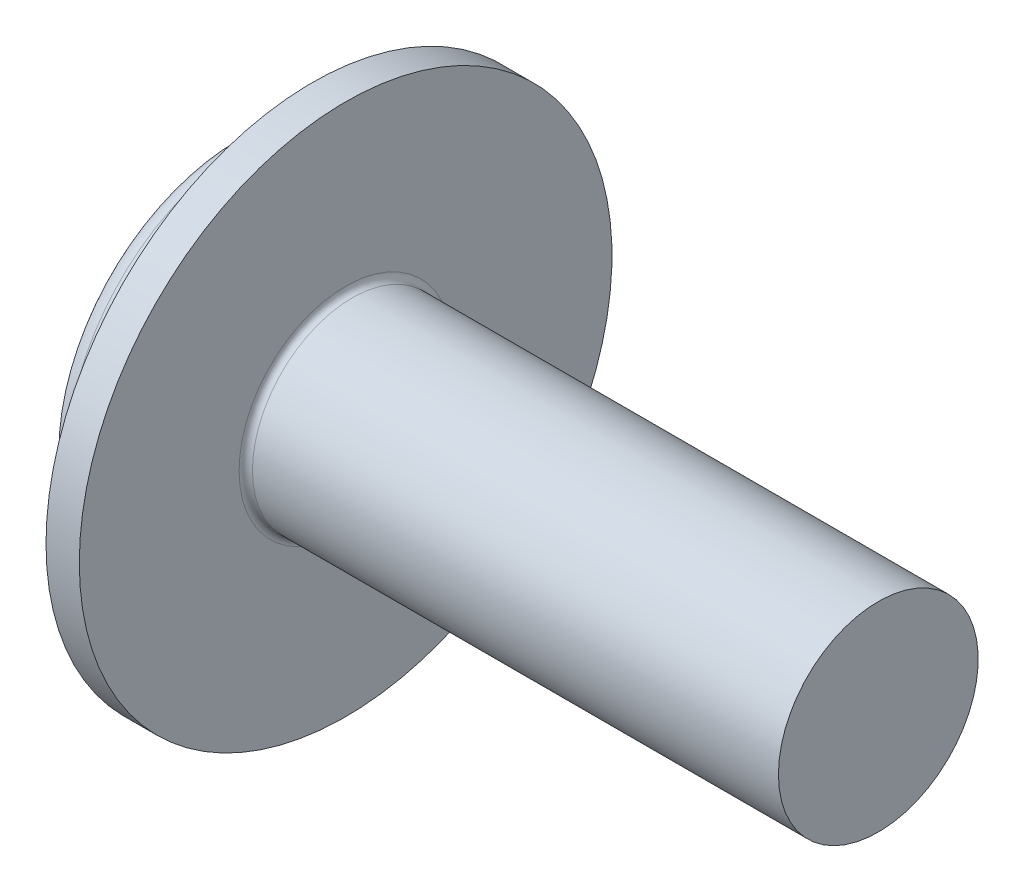
ISO-10303-21;
HEADER;
FILE_DESCRIPTION(('STEP AP214'),'2;1');
FILE_NAME('part.step','',(''),(''),'','','');
FILE_SCHEMA(('AUTOMOTIVE_DESIGN { 1 0 10303 214 1 1 1 1 }'));
ENDSEC;
DATA;
#1=APPLICATION_CONTEXT('core data for automotive mechanical design processes');
#2=APPLICATION_PROTOCOL_DEFINITION('international standard','automotive_design',2000,#1);
#3=PRODUCT_CONTEXT('',#1,'mechanical');
#4=PRODUCT('Part','Part','',(#3));
#5=PRODUCT_RELATED_PRODUCT_CATEGORY('part','',(#4));
#6=PRODUCT_DEFINITION_FORMATION('','',#4);
#7=PRODUCT_DEFINITION_CONTEXT('part definition',#1,'design');
#8=PRODUCT_DEFINITION('design','',#6,#7);
#9=PRODUCT_DEFINITION_SHAPE('','',#8);
#10=(LENGTH_UNIT() NAMED_UNIT(*) SI_UNIT(.MILLI.,.METRE.));
#11=(NAMED_UNIT(*) PLANE_ANGLE_UNIT() SI_UNIT($,.RADIAN.));
#12=(NAMED_UNIT(*) SI_UNIT($,.STERADIAN.) SOLID_ANGLE_UNIT());
#13=UNCERTAINTY_MEASURE_WITH_UNIT(LENGTH_MEASURE(1.E-05),#10,'distance_accuracy_value','');
#14=(GEOMETRIC_REPRESENTATION_CONTEXT(3) GLOBAL_UNCERTAINTY_ASSIGNED_CONTEXT((#13)) GLOBAL_UNIT_ASSIGNED_CONTEXT((#10,
#11,#12)) REPRESENTATION_CONTEXT('',''));
#15=CARTESIAN_POINT('',(0.,0.,0.));
#16=DIRECTION('',(0.,0.,1.));
#17=DIRECTION('',(1.,0.,0.));
#18=AXIS2_PLACEMENT_3D('',#15,#16,#17);
#19=CARTESIAN_POINT('',(-25.4,0.,0.));
#20=DIRECTION('',(-1.,0.,0.));
#21=DIRECTION('',(0.,0.,1.));
#22=AXIS2_PLACEMENT_3D('',#19,#20,#21);
#23=CYLINDRICAL_SURFACE('',#22,1.5);
#24=CARTESIAN_POINT('',(2.5,0.,0.));
#25=DIRECTION('',(-1.,0.,0.));
#26=DIRECTION('',(0.,0.,1.));
#27=AXIS2_PLACEMENT_3D('',#24,#25,#26);
#28=CIRCLE('',#27,1.5);
#29=CARTESIAN_POINT('',(2.5,0.,1.5));
#30=VERTEX_POINT('',#29);
#31=EDGE_CURVE('E293',#30,#30,#28,.F.);
#32=ORIENTED_EDGE('',*,*,#31,.T.);
#33=EDGE_LOOP('',(#32));
#34=FACE_BOUND('',#33,.T.);
#35=CARTESIAN_POINT('',(10.4,0.,0.));
#36=DIRECTION('',(-1.,0.,0.));
#37=DIRECTION('',(0.,0.,1.));
#38=AXIS2_PLACEMENT_3D('',#35,#36,#37);
#39=CIRCLE('',#38,1.5);
#40=CARTESIAN_POINT('',(10.4,0.,1.5));
#41=VERTEX_POINT('',#40);
#42=EDGE_CURVE('E247',#41,#41,#39,.T.);
#43=ORIENTED_EDGE('',*,*,#42,.T.);
#44=EDGE_LOOP('',(#43));
#45=FACE_BOUND('',#44,.T.);
#46=ADVANCED_FACE('F42',(#34,#45),#23,.T.);
#47=CARTESIAN_POINT('',(2.4,1.5,0.));
#48=DIRECTION('',(-1.,0.,0.));
#49=DIRECTION('',(0.,0.,1.));
#50=AXIS2_PLACEMENT_3D('',#47,#48,#49);
#51=PLANE('',#50);
#52=CARTESIAN_POINT('',(2.4,0.,0.));
#53=DIRECTION('',(-1.,0.,0.));
#54=DIRECTION('',(0.,0.,1.));
#55=AXIS2_PLACEMENT_3D('',#52,#53,#54);
#56=CIRCLE('',#55,1.6);
#57=CARTESIAN_POINT('',(2.4,0.,1.6));
#58=VERTEX_POINT('',#57);
#59=EDGE_CURVE('E289',#58,#58,#56,.T.);
#60=ORIENTED_EDGE('',*,*,#59,.T.);
#61=EDGE_LOOP('',(#60));
#62=FACE_BOUND('',#61,.T.);
#63=CARTESIAN_POINT('',(2.4,0.,0.));
#64=DIRECTION('',(-1.,0.,0.));
#65=DIRECTION('',(0.,0.,1.));
#66=AXIS2_PLACEMENT_3D('',#63,#64,#65);
#67=CIRCLE('',#66,4.);
#68=CARTESIAN_POINT('',(2.4,0.,4.));
#69=VERTEX_POINT('',#68);
#70=EDGE_CURVE('E206',#69,#69,#67,.T.);
#71=ORIENTED_EDGE('',*,*,#70,.F.);
#72=EDGE_LOOP('',(#71));
#73=FACE_BOUND('',#72,.T.);
#74=ADVANCED_FACE('F419',(#62,#73),#51,.F.);
#75=CARTESIAN_POINT('',(10.4,1.5,0.));
#76=DIRECTION('',(1.,0.,0.));
#77=DIRECTION('',(0.,0.,-1.));
#78=AXIS2_PLACEMENT_3D('',#75,#76,#77);
#79=PLANE('',#78);
#80=ORIENTED_EDGE('',*,*,#42,.F.);
#81=EDGE_LOOP('',(#80));
#82=FACE_BOUND('',#81,.T.);
#83=ADVANCED_FACE('F424',(#82),#79,.T.);
#84=CARTESIAN_POINT('',(2.5,0.,0.));
#85=DIRECTION('',(-1.,0.,0.));
#86=DIRECTION('',(0.,0.,1.));
#87=AXIS2_PLACEMENT_3D('',#84,#85,#86);
#88=TOROIDAL_SURFACE('',#87,1.6,0.1);
#89=ORIENTED_EDGE('',*,*,#31,.F.);
#90=EDGE_LOOP('',(#89));
#91=FACE_BOUND('',#90,.T.);
#92=ORIENTED_EDGE('',*,*,#59,.F.);
#93=EDGE_LOOP('',(#92));
#94=FACE_BOUND('',#93,.T.);
#95=ADVANCED_FACE('F44',(#91,#94),#88,.F.);
#96=CARTESIAN_POINT('',(1.9,0.,0.));
#97=DIRECTION('',(-1.,0.,0.));
#98=DIRECTION('',(0.,0.,1.));
#99=AXIS2_PLACEMENT_3D('',#96,#97,#98);
#100=PLANE('',#99);
#101=CARTESIAN_POINT('',(1.9,0.,0.));
#102=DIRECTION('',(-1.,0.,0.));
#103=DIRECTION('',(0.,0.,1.));
#104=AXIS2_PLACEMENT_3D('',#101,#102,#103);
#105=CIRCLE('',#104,4.);
#106=CARTESIAN_POINT('',(1.9,0.,4.));
#107=VERTEX_POINT('',#106);
#108=EDGE_CURVE('E591',#107,#107,#105,.T.);
#109=ORIENTED_EDGE('',*,*,#108,.T.);
#110=EDGE_LOOP('',(#109));
#111=FACE_BOUND('',#110,.T.);
#112=CARTESIAN_POINT('',(1.9,0.,0.));
#113=DIRECTION('',(-1.,0.,0.));
#114=DIRECTION('',(0.,0.,1.));
#115=AXIS2_PLACEMENT_3D('',#112,#113,#114);
#116=CIRCLE('',#115,2.8);
#117=CARTESIAN_POINT('',(1.9,0.,2.8));
#118=VERTEX_POINT('',#117);
#119=EDGE_CURVE('E12',#118,#118,#116,.F.);
#120=ORIENTED_EDGE('',*,*,#119,.T.);
#121=EDGE_LOOP('',(#120));
#122=FACE_BOUND('',#121,.T.);
#123=ADVANCED_FACE('F596',(#111,#122),#100,.T.);
#124=CARTESIAN_POINT('',(0.,0.,0.));
#125=DIRECTION('',(-1.,0.,0.));
#126=DIRECTION('',(0.,0.,1.));
#127=AXIS2_PLACEMENT_3D('',#124,#125,#126);
#128=CYLINDRICAL_SURFACE('',#127,4.);
#129=ORIENTED_EDGE('',*,*,#70,.T.);
#130=EDGE_LOOP('',(#129));
#131=FACE_BOUND('',#130,.T.);
#132=ORIENTED_EDGE('',*,*,#108,.F.);
#133=EDGE_LOOP('',(#132));
#134=FACE_BOUND('',#133,.T.);
#135=ADVANCED_FACE('F599',(#131,#134),#128,.T.);
#136=CARTESIAN_POINT('',(1.75,-0.369999999999998,-0.527482331818933));
#137=DIRECTION('',(0.,1.,0.));
#138=DIRECTION('',(0.,0.,1.));
#139=AXIS2_PLACEMENT_3D('',#136,#137,#138);
#140=PLANE('',#139);
#141=DIRECTION('',(0.,0.,-1.));
#142=VECTOR('',#141,1.);
#143=CARTESIAN_POINT('',(1.75,-0.370000000000002,0.52748233181893));
#144=LINE('',#143,#142);
#145=CARTESIAN_POINT('',(1.75,-0.370000000000002,0.52748233181893));
#146=VERTEX_POINT('',#145);
#147=CARTESIAN_POINT('',(1.75,-0.370000000000001,0.415013252800436));
#148=VERTEX_POINT('',#147);
#149=EDGE_CURVE('E231',#146,#148,#144,.T.);
#150=ORIENTED_EDGE('',*,*,#149,.T.);
#151=CARTESIAN_POINT('',(-0.987293237053716,-0.370000000000002,0.649401255967159));
#152=CARTESIAN_POINT('',(-0.781914975317084,-0.370000000000002,0.63286588700287));
#153=CARTESIAN_POINT('',(-0.576547882393372,-0.370000000000002,0.616188977635079));
#154=CARTESIAN_POINT('',(-0.165841599226327,-0.370000000000002,0.582441031964225));
#155=CARTESIAN_POINT('',(0.039497590309045,-0.370000000000002,0.565369987054878));
#156=CARTESIAN_POINT('',(0.450133475422572,-0.370000000000002,0.530723441326534));
#157=CARTESIAN_POINT('',(0.655430171010573,-0.370000000000002,0.513147940624556));
#158=CARTESIAN_POINT('',(1.06596140177934,-0.370000000000002,0.477314957985792));
#159=CARTESIAN_POINT('',(1.2711959378071,-0.370000000000002,0.459057485806065));
#160=CARTESIAN_POINT('',(1.61065292365626,-0.370000000000001,0.428051938688767));
#161=CARTESIAN_POINT('',(1.74490059995642,-0.370000000000001,0.41558082499093));
#162=CARTESIAN_POINT('',(2.01334321762763,-0.370000000000001,0.390092023404978));
#163=CARTESIAN_POINT('',(2.14753815934577,-0.370000000000001,0.377074339177352));
#164=CARTESIAN_POINT('',(2.41586354151957,-0.370000000000001,0.350315629452841));
#165=CARTESIAN_POINT('',(2.5499939784531,-0.370000000000001,0.336574568177649));
#166=CARTESIAN_POINT('',(2.81814173295471,-0.370000000000001,0.308004077741874));
#167=CARTESIAN_POINT('',(2.95215904765134,-0.370000000000001,0.293174621747064));
#168=CARTESIAN_POINT('',(3.0860955068368,-0.370000000000001,0.277618485071814));
#169=B_SPLINE_CURVE_WITH_KNOTS('',3,(#151,#152,#153,#154,#155,#156,#157,#158,#159,#160,#161,
#162,#163,#164,#165,#166,#167,#168),.UNSPECIFIED.,.F.,.F.,(4,2,2,2,2,2,2,2,4),(0.,
0.618128793984691,1.23627109812525,1.85441325887562,2.4725465791681,2.87702276218609,
3.28149623678161,3.68598973550942,4.09049321032311),.UNSPECIFIED.);
#170=CARTESIAN_POINT('',(0.0457951200896421,-0.370000000000002,0.564760133040916));
#171=VERTEX_POINT('',#170);
#172=EDGE_CURVE('E193',#148,#171,#169,.F.);
#173=ORIENTED_EDGE('',*,*,#172,.T.);
#174=CARTESIAN_POINT('',(5.,-0.37,0.));
#175=DIRECTION('',(0.,1.,0.));
#176=DIRECTION('',(0.,0.,1.));
#177=AXIS2_PLACEMENT_3D('',#174,#175,#176);
#178=CIRCLE('',#177,4.98629120689917);
#179=CARTESIAN_POINT('',(0.18786973422864,-0.370000000000005,1.30633162146802));
#180=VERTEX_POINT('',#179);
#181=EDGE_CURVE('E234',#171,#180,#178,.T.);
#182=ORIENTED_EDGE('',*,*,#181,.T.);
#183=DIRECTION('',(0.894934391398442,0.,-0.446197753347436));
#184=VECTOR('',#183,1.);
#185=CARTESIAN_POINT('',(0.,-0.370000000000005,1.4));
#186=LINE('',#185,#184);
#187=EDGE_CURVE('E496',#180,#146,#186,.T.);
#188=ORIENTED_EDGE('',*,*,#187,.T.);
#189=EDGE_LOOP('',(#150,#173,#182,#188));
#190=FACE_BOUND('',#189,.T.);
#191=ADVANCED_FACE('F330',(#190),#140,.T.);
#192=CARTESIAN_POINT('',(1.75,-0.527482331818931,0.37));
#193=DIRECTION('',(0.,0.,-1.));
#194=DIRECTION('',(0.,1.,0.));
#195=AXIS2_PLACEMENT_3D('',#192,#193,#194);
#196=PLANE('',#195);
#197=CARTESIAN_POINT('',(5.,0.,0.37));
#198=DIRECTION('',(0.,0.,-1.));
#199=DIRECTION('',(0.,1.,0.));
#200=AXIS2_PLACEMENT_3D('',#197,#198,#199);
#201=CIRCLE('',#200,4.98629120689917);
#202=CARTESIAN_POINT('',(0.187869734228639,-1.30633162146802,0.37));
#203=VERTEX_POINT('',#202);
#204=CARTESIAN_POINT('',(0.0457951200896417,-0.564760133040916,0.37));
#205=VERTEX_POINT('',#204);
#206=EDGE_CURVE('E302',#203,#205,#201,.T.);
#207=ORIENTED_EDGE('',*,*,#206,.T.);
#208=CARTESIAN_POINT('',(-0.987293237069635,-0.649401255968442,0.37));
#209=CARTESIAN_POINT('',(-0.781914975331301,-0.632865887004023,0.37));
#210=CARTESIAN_POINT('',(-0.576547882405888,-0.616188977636102,0.37));
#211=CARTESIAN_POINT('',(-0.16584159923544,-0.582441031964983,0.37));
#212=CARTESIAN_POINT('',(0.0394975903016338,-0.5653699870555,0.37));
#213=CARTESIAN_POINT('',(0.450133475420601,-0.530723441326706,0.37));
#214=CARTESIAN_POINT('',(0.655430171012341,-0.513147940624409,0.37));
#215=CARTESIAN_POINT('',(1.06596140178858,-0.477314957984981,0.37));
#216=CARTESIAN_POINT('',(1.27119593782008,-0.459057485804908,0.37));
#217=CARTESIAN_POINT('',(1.61065292367297,-0.428051938687225,0.37));
#218=CARTESIAN_POINT('',(1.74490059997313,-0.415580824989367,0.37));
#219=CARTESIAN_POINT('',(2.01334321764434,-0.390092023403371,0.37));
#220=CARTESIAN_POINT('',(2.14753815936247,-0.377074339175718,0.37));
#221=CARTESIAN_POINT('',(2.41586354153627,-0.350315629451146,0.37));
#222=CARTESIAN_POINT('',(2.54999397846979,-0.336574568175918,0.37));
#223=CARTESIAN_POINT('',(2.8181417329714,-0.308004077740054,0.37));
#224=CARTESIAN_POINT('',(2.95215904766802,-0.29317462174519,0.37));
#225=CARTESIAN_POINT('',(3.08609550685347,-0.277618485069873,0.37));
#226=B_SPLINE_CURVE_WITH_KNOTS('',3,(#208,#209,#210,#211,#212,#213,#214,#215,#216,#217,#218,
#219,#220,#221,#222,#223,#224,#225),.UNSPECIFIED.,.F.,.F.,(4,2,2,2,2,2,2,2,4),(0.,
0.61812879398981,1.23627109813549,1.85441325889711,2.47254657920086,2.87702276221884,
3.28149623681436,3.68598973554218,4.09049321035586),.UNSPECIFIED.);
#227=CARTESIAN_POINT('',(1.75,-0.415013252800437,0.37));
#228=VERTEX_POINT('',#227);
#229=EDGE_CURVE('E380',#205,#228,#226,.T.);
#230=ORIENTED_EDGE('',*,*,#229,.T.);
#231=DIRECTION('',(0.,-1.,0.));
#232=VECTOR('',#231,1.);
#233=CARTESIAN_POINT('',(1.75,0.527482331818931,0.37));
#234=LINE('',#233,#232);
#235=CARTESIAN_POINT('',(1.75,-0.527482331818932,0.37));
#236=VERTEX_POINT('',#235);
#237=EDGE_CURVE('E267',#228,#236,#234,.T.);
#238=ORIENTED_EDGE('',*,*,#237,.T.);
#239=DIRECTION('',(0.894934391398443,0.446197753347436,0.));
#240=VECTOR('',#239,1.);
#241=CARTESIAN_POINT('',(0.,-1.4,0.37));
#242=LINE('',#241,#240);
#243=EDGE_CURVE('E254',#203,#236,#242,.T.);
#244=ORIENTED_EDGE('',*,*,#243,.F.);
#245=EDGE_LOOP('',(#207,#230,#238,#244));
#246=FACE_BOUND('',#245,.T.);
#247=ADVANCED_FACE('F450',(#246),#196,.T.);
#248=CARTESIAN_POINT('',(0.,-1.4,-0.37));
#249=DIRECTION('',(0.446197753347436,-0.894934391398443,0.));
#250=DIRECTION('',(0.894934391398443,0.446197753347436,0.));
#251=AXIS2_PLACEMENT_3D('',#248,#249,#250);
#252=PLANE('',#251);
#253=CARTESIAN_POINT('',(2.6696526882832,-0.0689604923233252,0.));
#254=DIRECTION('',(0.446197753347436,-0.894934391398443,0.));
#255=DIRECTION('',(-0.894934391398443,-0.446197753347436,0.));
#256=AXIS2_PLACEMENT_3D('',#253,#254,#255);
#257=ELLIPSE('',#256,1.10195897609154,0.486831694838766);
#258=CARTESIAN_POINT('',(1.75,-0.527482331818932,-0.175779377683681));
#259=VERTEX_POINT('',#258);
#260=CARTESIAN_POINT('',(1.75,-0.527482331818932,0.175779377683681));
#261=VERTEX_POINT('',#260);
#262=EDGE_CURVE('E503',#259,#261,#257,.F.);
#263=ORIENTED_EDGE('',*,*,#262,.F.);
#264=DIRECTION('',(0.,0.,1.));
#265=VECTOR('',#264,1.);
#266=CARTESIAN_POINT('',(1.75,-0.527482331818931,-0.37));
#267=LINE('',#266,#265);
#268=CARTESIAN_POINT('',(1.75,-0.527482331818931,-0.37));
#269=VERTEX_POINT('',#268);
#270=EDGE_CURVE('E258',#269,#259,#267,.T.);
#271=ORIENTED_EDGE('',*,*,#270,.F.);
#272=DIRECTION('',(0.894934391398442,0.446197753347436,0.));
#273=VECTOR('',#272,1.);
#274=CARTESIAN_POINT('',(0.,-1.4,-0.37));
#275=LINE('',#274,#273);
#276=CARTESIAN_POINT('',(0.18786973422864,-1.30633162146802,-0.37));
#277=VERTEX_POINT('',#276);
#278=EDGE_CURVE('E251',#277,#269,#275,.T.);
#279=ORIENTED_EDGE('',*,*,#278,.F.);
#280=CARTESIAN_POINT('',(4.56358262530798,0.875317983305919,0.));
#281=DIRECTION('',(0.446197753347436,-0.894934391398443,0.));
#282=DIRECTION('',(0.894934391398443,0.446197753347436,0.));
#283=AXIS2_PLACEMENT_3D('',#280,#281,#282);
#284=CIRCLE('',#283,4.90340272700175);
#285=EDGE_CURVE('E297',#203,#277,#284,.T.);
#286=ORIENTED_EDGE('',*,*,#285,.F.);
#287=ORIENTED_EDGE('',*,*,#243,.T.);
#288=EDGE_CURVE('E262',#261,#236,#267,.T.);
#289=ORIENTED_EDGE('',*,*,#288,.F.);
#290=EDGE_LOOP('',(#263,#271,#279,#286,#287,#289));
#291=FACE_BOUND('',#290,.T.);
#292=ADVANCED_FACE('F447',(#291),#252,.F.);
#293=CARTESIAN_POINT('',(1.75,0.527482331818931,-0.37));
#294=DIRECTION('',(0.,0.,1.));
#295=DIRECTION('',(1.,0.,0.));
#296=AXIS2_PLACEMENT_3D('',#293,#294,#295);
#297=PLANE('',#296);
#298=DIRECTION('',(0.,1.,0.));
#299=VECTOR('',#298,1.);
#300=CARTESIAN_POINT('',(1.75,-0.527482331818931,-0.37));
#301=LINE('',#300,#299);
#302=CARTESIAN_POINT('',(1.75,-0.415013252800437,-0.37));
#303=VERTEX_POINT('',#302);
#304=EDGE_CURVE('E273',#269,#303,#301,.T.);
#305=ORIENTED_EDGE('',*,*,#304,.T.);
#306=CARTESIAN_POINT('',(-0.987293237053716,-0.649401255967161,-0.37));
#307=CARTESIAN_POINT('',(-0.781914975317084,-0.632865887002871,-0.37));
#308=CARTESIAN_POINT('',(-0.576547882393372,-0.616188977635081,-0.37));
#309=CARTESIAN_POINT('',(-0.165841599226327,-0.582441031964227,-0.37));
#310=CARTESIAN_POINT('',(0.0394975903090452,-0.56536998705488,-0.37));
#311=CARTESIAN_POINT('',(0.450133475422572,-0.530723441326535,-0.37));
#312=CARTESIAN_POINT('',(0.655430171010573,-0.513147940624557,-0.37));
#313=CARTESIAN_POINT('',(1.06596140177934,-0.477314957985794,-0.37));
#314=CARTESIAN_POINT('',(1.2711959378071,-0.459057485806066,-0.37));
#315=CARTESIAN_POINT('',(1.61065292365626,-0.428051938688768,-0.37));
#316=CARTESIAN_POINT('',(1.74490059995643,-0.415580824990931,-0.37));
#317=CARTESIAN_POINT('',(2.01334321762763,-0.390092023404979,-0.37));
#318=CARTESIAN_POINT('',(2.14753815934577,-0.377074339177353,-0.37));
#319=CARTESIAN_POINT('',(2.41586354151957,-0.350315629452843,-0.37));
#320=CARTESIAN_POINT('',(2.5499939784531,-0.33657456817765,-0.37));
#321=CARTESIAN_POINT('',(2.81814173295471,-0.308004077741875,-0.37));
#322=CARTESIAN_POINT('',(2.95215904765134,-0.293174621747065,-0.37));
#323=CARTESIAN_POINT('',(3.0860955068368,-0.277618485071816,-0.37));
#324=B_SPLINE_CURVE_WITH_KNOTS('',3,(#306,#307,#308,#309,#310,#311,#312,#313,#314,#315,#316,
#317,#318,#319,#320,#321,#322,#323),.UNSPECIFIED.,.F.,.F.,(4,2,2,2,2,2,2,2,4),(0.,
0.618128793984691,1.23627109812525,1.85441325887562,2.4725465791681,2.87702276218609,
3.28149623678161,3.68598973550942,4.09049321032311),.UNSPECIFIED.);
#325=CARTESIAN_POINT('',(0.0457951200896417,-0.564760133040915,-0.37));
#326=VERTEX_POINT('',#325);
#327=EDGE_CURVE('E351',#303,#326,#324,.F.);
#328=ORIENTED_EDGE('',*,*,#327,.T.);
#329=CARTESIAN_POINT('',(5.,0.,-0.37));
#330=DIRECTION('',(0.,0.,1.));
#331=DIRECTION('',(1.,0.,0.));
#332=AXIS2_PLACEMENT_3D('',#329,#330,#331);
#333=CIRCLE('',#332,4.98629120689917);
#334=EDGE_CURVE('E67',#326,#277,#333,.T.);
#335=ORIENTED_EDGE('',*,*,#334,.T.);
#336=ORIENTED_EDGE('',*,*,#278,.T.);
#337=EDGE_LOOP('',(#305,#328,#335,#336));
#338=FACE_BOUND('',#337,.T.);
#339=ADVANCED_FACE('F449',(#338),#297,.T.);
#340=CARTESIAN_POINT('',(0.187869734228639,-0.369999999999995,-1.30633162146802));
#341=VERTEX_POINT('',#340);
#342=CARTESIAN_POINT('',(0.0457951200896426,-0.369999999999998,-0.564760133040918));
#343=VERTEX_POINT('',#342);
#344=EDGE_CURVE('E237',#341,#343,#178,.T.);
#345=ORIENTED_EDGE('',*,*,#344,.T.);
#346=CARTESIAN_POINT('',(-0.987293237053716,-0.369999999999998,-0.649401255967162));
#347=CARTESIAN_POINT('',(-0.781914975317084,-0.369999999999998,-0.632865887002873));
#348=CARTESIAN_POINT('',(-0.576547882393372,-0.369999999999998,-0.616188977635082));
#349=CARTESIAN_POINT('',(-0.165841599226327,-0.369999999999998,-0.582441031964228));
#350=CARTESIAN_POINT('',(0.0394975903090453,-0.369999999999998,-0.565369987054881));
#351=CARTESIAN_POINT('',(0.450133475422572,-0.369999999999998,-0.530723441326536));
#352=CARTESIAN_POINT('',(0.655430171010573,-0.369999999999998,-0.513147940624558));
#353=CARTESIAN_POINT('',(1.06596140177934,-0.369999999999998,-0.477314957985795));
#354=CARTESIAN_POINT('',(1.2711959378071,-0.369999999999998,-0.459057485806067));
#355=CARTESIAN_POINT('',(1.61065292365626,-0.369999999999998,-0.42805193868877));
#356=CARTESIAN_POINT('',(1.74490059995643,-0.369999999999998,-0.415580824990932));
#357=CARTESIAN_POINT('',(2.01334321762763,-0.369999999999999,-0.390092023404981));
#358=CARTESIAN_POINT('',(2.14753815934577,-0.369999999999999,-0.377074339177355));
#359=CARTESIAN_POINT('',(2.41586354151957,-0.369999999999999,-0.350315629452844));
#360=CARTESIAN_POINT('',(2.5499939784531,-0.369999999999999,-0.336574568177652));
#361=CARTESIAN_POINT('',(2.81814173295471,-0.369999999999999,-0.308004077741877));
#362=CARTESIAN_POINT('',(2.95215904765134,-0.369999999999999,-0.293174621747066));
#363=CARTESIAN_POINT('',(3.0860955068368,-0.369999999999999,-0.277618485071817));
#364=B_SPLINE_CURVE_WITH_KNOTS('',3,(#346,#347,#348,#349,#350,#351,#352,#353,#354,#355,#356,
#357,#358,#359,#360,#361,#362,#363),.UNSPECIFIED.,.F.,.F.,(4,2,2,2,2,2,2,2,4),(0.,
0.618128793984691,1.23627109812525,1.85441325887562,2.4725465791681,2.87702276218609,
3.28149623678161,3.68598973550942,4.09049321032311),.UNSPECIFIED.);
#365=CARTESIAN_POINT('',(1.75,-0.369999999999998,-0.415013252800438));
#366=VERTEX_POINT('',#365);
#367=EDGE_CURVE('E321',#343,#366,#364,.T.);
#368=ORIENTED_EDGE('',*,*,#367,.T.);
#369=CARTESIAN_POINT('',(1.75,-0.369999999999998,-0.527482331818933));
#370=VERTEX_POINT('',#369);
#371=EDGE_CURVE('E227',#366,#370,#144,.T.);
#372=ORIENTED_EDGE('',*,*,#371,.T.);
#373=DIRECTION('',(0.894934391398443,0.,0.446197753347436));
#374=VECTOR('',#373,1.);
#375=CARTESIAN_POINT('',(0.,-0.369999999999995,-1.4));
#376=LINE('',#375,#374);
#377=EDGE_CURVE('E488',#341,#370,#376,.T.);
#378=ORIENTED_EDGE('',*,*,#377,.F.);
#379=EDGE_LOOP('',(#345,#368,#372,#378));
#380=FACE_BOUND('',#379,.T.);
#381=ADVANCED_FACE('F465',(#380),#140,.T.);
#382=CARTESIAN_POINT('',(0.,0.370000000000005,-1.4));
#383=DIRECTION('',(0.446197753347436,0.,-0.894934391398443));
#384=DIRECTION('',(0.894934391398443,0.,0.446197753347436));
#385=AXIS2_PLACEMENT_3D('',#382,#383,#384);
#386=PLANE('',#385);
#387=CARTESIAN_POINT('',(2.6696526882832,0.,-0.0689604923233253));
#388=DIRECTION('',(0.446197753347436,0.,-0.894934391398443));
#389=DIRECTION('',(-0.894934391398443,0.,-0.446197753347436));
#390=AXIS2_PLACEMENT_3D('',#387,#388,#389);
#391=ELLIPSE('',#390,1.10195897609154,0.486831694838766);
#392=CARTESIAN_POINT('',(1.75,0.175779377683684,-0.527482331818931));
#393=VERTEX_POINT('',#392);
#394=CARTESIAN_POINT('',(1.75,-0.17577937768368,-0.527482331818932));
#395=VERTEX_POINT('',#394);
#396=EDGE_CURVE('E194',#393,#395,#391,.F.);
#397=ORIENTED_EDGE('',*,*,#396,.F.);
#398=DIRECTION('',(0.,-1.,0.));
#399=VECTOR('',#398,1.);
#400=CARTESIAN_POINT('',(1.75,0.370000000000002,-0.52748233181893));
#401=LINE('',#400,#399);
#402=CARTESIAN_POINT('',(1.75,0.370000000000002,-0.52748233181893));
#403=VERTEX_POINT('',#402);
#404=EDGE_CURVE('E476',#403,#393,#401,.T.);
#405=ORIENTED_EDGE('',*,*,#404,.F.);
#406=DIRECTION('',(0.894934391398442,0.,0.446197753347436));
#407=VECTOR('',#406,1.);
#408=CARTESIAN_POINT('',(0.,0.370000000000005,-1.4));
#409=LINE('',#408,#407);
#410=CARTESIAN_POINT('',(0.18786973422864,0.370000000000005,-1.30633162146802));
#411=VERTEX_POINT('',#410);
#412=EDGE_CURVE('E491',#411,#403,#409,.T.);
#413=ORIENTED_EDGE('',*,*,#412,.F.);
#414=CARTESIAN_POINT('',(4.56358262530798,0.,0.875317983305919));
#415=DIRECTION('',(0.446197753347436,0.,-0.894934391398443));
#416=DIRECTION('',(-0.894934391398443,0.,-0.446197753347436));
#417=AXIS2_PLACEMENT_3D('',#414,#415,#416);
#418=CIRCLE('',#417,4.90340272700175);
#419=EDGE_CURVE('E314',#341,#411,#418,.T.);
#420=ORIENTED_EDGE('',*,*,#419,.F.);
#421=ORIENTED_EDGE('',*,*,#377,.T.);
#422=EDGE_CURVE('E479',#395,#370,#401,.T.);
#423=ORIENTED_EDGE('',*,*,#422,.F.);
#424=EDGE_LOOP('',(#397,#405,#413,#420,#421,#423));
#425=FACE_BOUND('',#424,.T.);
#426=ADVANCED_FACE('F416',(#425),#386,.F.);
#427=CARTESIAN_POINT('',(1.75,0.369999999999998,0.527482331818932));
#428=DIRECTION('',(0.,-1.,0.));
#429=DIRECTION('',(1.,0.,0.));
#430=AXIS2_PLACEMENT_3D('',#427,#428,#429);
#431=PLANE('',#430);
#432=DIRECTION('',(0.,0.,1.));
#433=VECTOR('',#432,1.);
#434=CARTESIAN_POINT('',(1.75,0.370000000000002,-0.52748233181893));
#435=LINE('',#434,#433);
#436=CARTESIAN_POINT('',(1.75,0.370000000000001,-0.415013252800436));
#437=VERTEX_POINT('',#436);
#438=EDGE_CURVE('E223',#403,#437,#435,.T.);
#439=ORIENTED_EDGE('',*,*,#438,.T.);
#440=CARTESIAN_POINT('',(-0.987293237053716,0.370000000000002,-0.649401255967159));
#441=CARTESIAN_POINT('',(-0.781914975317084,0.370000000000002,-0.63286588700287));
#442=CARTESIAN_POINT('',(-0.576547882393372,0.370000000000002,-0.61618897763508));
#443=CARTESIAN_POINT('',(-0.165841599226327,0.370000000000002,-0.582441031964225));
#444=CARTESIAN_POINT('',(0.039497590309045,0.370000000000002,-0.565369987054878));
#445=CARTESIAN_POINT('',(0.450133475422572,0.370000000000002,-0.530723441326533));
#446=CARTESIAN_POINT('',(0.655430171010573,0.370000000000002,-0.513147940624555));
#447=CARTESIAN_POINT('',(1.06596140177934,0.370000000000002,-0.477314957985793));
#448=CARTESIAN_POINT('',(1.2711959378071,0.370000000000002,-0.459057485806065));
#449=CARTESIAN_POINT('',(1.61065292365626,0.370000000000001,-0.428051938688767));
#450=CARTESIAN_POINT('',(1.74490059995642,0.370000000000001,-0.41558082499093));
#451=CARTESIAN_POINT('',(2.01334321762763,0.370000000000001,-0.390092023404978));
#452=CARTESIAN_POINT('',(2.14753815934577,0.370000000000001,-0.377074339177352));
#453=CARTESIAN_POINT('',(2.41586354151957,0.370000000000001,-0.350315629452841));
#454=CARTESIAN_POINT('',(2.5499939784531,0.370000000000001,-0.336574568177649));
#455=CARTESIAN_POINT('',(2.81814173295471,0.370000000000001,-0.308004077741874));
#456=CARTESIAN_POINT('',(2.95215904765134,0.370000000000001,-0.293174621747064));
#457=CARTESIAN_POINT('',(3.0860955068368,0.370000000000001,-0.277618485071814));
#458=B_SPLINE_CURVE_WITH_KNOTS('',3,(#440,#441,#442,#443,#444,#445,#446,#447,#448,#449,#450,
#451,#452,#453,#454,#455,#456,#457),.UNSPECIFIED.,.F.,.F.,(4,2,2,2,2,2,2,2,4),(0.,
0.618128793984691,1.23627109812525,1.85441325887562,2.4725465791681,2.87702276218609,
3.28149623678161,3.68598973550942,4.09049321032311),.UNSPECIFIED.);
#459=CARTESIAN_POINT('',(0.0457951200896425,0.370000000000002,-0.564760133040916));
#460=VERTEX_POINT('',#459);
#461=EDGE_CURVE('E360',#437,#460,#458,.F.);
#462=ORIENTED_EDGE('',*,*,#461,.T.);
#463=CARTESIAN_POINT('',(5.,0.37,0.));
#464=DIRECTION('',(0.,-1.,0.));
#465=DIRECTION('',(0.,0.,-1.));
#466=AXIS2_PLACEMENT_3D('',#463,#464,#465);
#467=CIRCLE('',#466,4.98629120689917);
#468=EDGE_CURVE('E242',#460,#411,#467,.T.);
#469=ORIENTED_EDGE('',*,*,#468,.T.);
#470=ORIENTED_EDGE('',*,*,#412,.T.);
#471=EDGE_LOOP('',(#439,#462,#469,#470));
#472=FACE_BOUND('',#471,.T.);
#473=ADVANCED_FACE('F404',(#472),#431,.T.);
#474=CARTESIAN_POINT('',(0.18786973422864,1.30633162146802,-0.37));
#475=VERTEX_POINT('',#474);
#476=CARTESIAN_POINT('',(0.0457951200896417,0.564760133040916,-0.37));
#477=VERTEX_POINT('',#476);
#478=EDGE_CURVE('E306',#475,#477,#333,.T.);
#479=ORIENTED_EDGE('',*,*,#478,.T.);
#480=CARTESIAN_POINT('',(-0.987293237053716,0.649401255967161,-0.37));
#481=CARTESIAN_POINT('',(-0.781914975317084,0.632865887002871,-0.37));
#482=CARTESIAN_POINT('',(-0.576547882393372,0.616188977635081,-0.37));
#483=CARTESIAN_POINT('',(-0.165841599226327,0.582441031964227,-0.37));
#484=CARTESIAN_POINT('',(0.0394975903090451,0.56536998705488,-0.37));
#485=CARTESIAN_POINT('',(0.450133475422572,0.530723441326535,-0.37));
#486=CARTESIAN_POINT('',(0.655430171010573,0.513147940624557,-0.37));
#487=CARTESIAN_POINT('',(1.06596140177934,0.477314957985794,-0.37));
#488=CARTESIAN_POINT('',(1.2711959378071,0.459057485806066,-0.37));
#489=CARTESIAN_POINT('',(1.61065292365626,0.428051938688769,-0.37));
#490=CARTESIAN_POINT('',(1.74490059995642,0.415580824990931,-0.37));
#491=CARTESIAN_POINT('',(2.01334321762763,0.39009202340498,-0.37));
#492=CARTESIAN_POINT('',(2.14753815934577,0.377074339177353,-0.37));
#493=CARTESIAN_POINT('',(2.41586354151957,0.350315629452843,-0.37));
#494=CARTESIAN_POINT('',(2.5499939784531,0.33657456817765,-0.37));
#495=CARTESIAN_POINT('',(2.81814173295471,0.308004077741875,-0.37));
#496=CARTESIAN_POINT('',(2.95215904765134,0.293174621747065,-0.37));
#497=CARTESIAN_POINT('',(3.0860955068368,0.277618485071816,-0.37));
#498=B_SPLINE_CURVE_WITH_KNOTS('',3,(#480,#481,#482,#483,#484,#485,#486,#487,#488,#489,#490,
#491,#492,#493,#494,#495,#496,#497),.UNSPECIFIED.,.F.,.F.,(4,2,2,2,2,2,2,2,4),(0.,
0.618128793984691,1.23627109812525,1.85441325887562,2.4725465791681,2.87702276218609,
3.28149623678161,3.68598973550942,4.09049321032311),.UNSPECIFIED.);
#499=CARTESIAN_POINT('',(1.75,0.415013252800437,-0.37));
#500=VERTEX_POINT('',#499);
#501=EDGE_CURVE('E367',#477,#500,#498,.T.);
#502=ORIENTED_EDGE('',*,*,#501,.T.);
#503=CARTESIAN_POINT('',(1.75,0.527482331818931,-0.37));
#504=VERTEX_POINT('',#503);
#505=EDGE_CURVE('E277',#500,#504,#301,.T.);
#506=ORIENTED_EDGE('',*,*,#505,.T.);
#507=DIRECTION('',(0.894934391398442,-0.446197753347436,0.));
#508=VECTOR('',#507,1.);
#509=CARTESIAN_POINT('',(0.,1.4,-0.37));
#510=LINE('',#509,#508);
#511=EDGE_CURVE('E243',#475,#504,#510,.T.);
#512=ORIENTED_EDGE('',*,*,#511,.F.);
#513=EDGE_LOOP('',(#479,#502,#506,#512));
#514=FACE_BOUND('',#513,.T.);
#515=ADVANCED_FACE('F415',(#514),#297,.T.);
#516=CARTESIAN_POINT('',(1.75,0.527482331818931,0.37));
#517=DIRECTION('',(0.446197753347436,0.894934391398443,0.));
#518=DIRECTION('',(-0.894934391398442,0.446197753347436,0.));
#519=AXIS2_PLACEMENT_3D('',#516,#517,#518);
#520=PLANE('',#519);
#521=CARTESIAN_POINT('',(2.6696526882832,0.0689604923233249,0.));
#522=DIRECTION('',(0.446197753347436,0.894934391398443,0.));
#523=DIRECTION('',(-0.894934391398443,0.446197753347436,0.));
#524=AXIS2_PLACEMENT_3D('',#521,#522,#523);
#525=ELLIPSE('',#524,1.10195897609154,0.486831694838766);
#526=CARTESIAN_POINT('',(1.75,0.527482331818932,0.175779377683682));
#527=VERTEX_POINT('',#526);
#528=CARTESIAN_POINT('',(1.75,0.527482331818932,-0.175779377683682));
#529=VERTEX_POINT('',#528);
#530=EDGE_CURVE('E501',#527,#529,#525,.F.);
#531=ORIENTED_EDGE('',*,*,#530,.F.);
#532=DIRECTION('',(0.,0.,-1.));
#533=VECTOR('',#532,1.);
#534=CARTESIAN_POINT('',(1.75,0.527482331818931,0.37));
#535=LINE('',#534,#533);
#536=CARTESIAN_POINT('',(1.75,0.527482331818931,0.37));
#537=VERTEX_POINT('',#536);
#538=EDGE_CURVE('E268',#537,#527,#535,.T.);
#539=ORIENTED_EDGE('',*,*,#538,.F.);
#540=DIRECTION('',(0.894934391398442,-0.446197753347436,0.));
#541=VECTOR('',#540,1.);
#542=CARTESIAN_POINT('',(0.,1.4,0.37));
#543=LINE('',#542,#541);
#544=CARTESIAN_POINT('',(0.18786973422864,1.30633162146802,0.37));
#545=VERTEX_POINT('',#544);
#546=EDGE_CURVE('E248',#545,#537,#543,.T.);
#547=ORIENTED_EDGE('',*,*,#546,.F.);
#548=CARTESIAN_POINT('',(4.56358262530798,-0.87531798330592,0.));
#549=DIRECTION('',(0.446197753347436,0.894934391398443,0.));
#550=DIRECTION('',(-0.894934391398442,0.446197753347436,0.));
#551=AXIS2_PLACEMENT_3D('',#548,#549,#550);
#552=CIRCLE('',#551,4.90340272700175);
#553=EDGE_CURVE('E310',#475,#545,#552,.T.);
#554=ORIENTED_EDGE('',*,*,#553,.F.);
#555=ORIENTED_EDGE('',*,*,#511,.T.);
#556=EDGE_CURVE('E272',#529,#504,#535,.T.);
#557=ORIENTED_EDGE('',*,*,#556,.F.);
#558=EDGE_LOOP('',(#531,#539,#547,#554,#555,#557));
#559=FACE_BOUND('',#558,.T.);
#560=ADVANCED_FACE('F454',(#559),#520,.F.);
#561=CARTESIAN_POINT('',(1.75,0.415013252800437,0.37));
#562=VERTEX_POINT('',#561);
#563=EDGE_CURVE('E263',#537,#562,#234,.T.);
#564=ORIENTED_EDGE('',*,*,#563,.T.);
#565=CARTESIAN_POINT('',(-0.987293237069635,0.649401255968442,0.37));
#566=CARTESIAN_POINT('',(-0.781914975331301,0.632865887004023,0.37));
#567=CARTESIAN_POINT('',(-0.576547882405888,0.616188977636102,0.37));
#568=CARTESIAN_POINT('',(-0.16584159923544,0.582441031964983,0.37));
#569=CARTESIAN_POINT('',(0.0394975903016338,0.5653699870555,0.37));
#570=CARTESIAN_POINT('',(0.450133475420601,0.530723441326706,0.37));
#571=CARTESIAN_POINT('',(0.655430171012341,0.513147940624409,0.37));
#572=CARTESIAN_POINT('',(1.06596140178858,0.477314957984981,0.37));
#573=CARTESIAN_POINT('',(1.27119593782008,0.459057485804908,0.37));
#574=CARTESIAN_POINT('',(1.61065292367297,0.428051938687225,0.37));
#575=CARTESIAN_POINT('',(1.74490059997313,0.415580824989367,0.37));
#576=CARTESIAN_POINT('',(2.01334321764434,0.39009202340337,0.37));
#577=CARTESIAN_POINT('',(2.14753815936247,0.377074339175718,0.37));
#578=CARTESIAN_POINT('',(2.41586354153627,0.350315629451146,0.37));
#579=CARTESIAN_POINT('',(2.54999397846979,0.336574568175918,0.37));
#580=CARTESIAN_POINT('',(2.8181417329714,0.308004077740054,0.37));
#581=CARTESIAN_POINT('',(2.95215904766802,0.29317462174519,0.37));
#582=CARTESIAN_POINT('',(3.08609550685347,0.277618485069873,0.37));
#583=B_SPLINE_CURVE_WITH_KNOTS('',3,(#565,#566,#567,#568,#569,#570,#571,#572,#573,#574,#575,
#576,#577,#578,#579,#580,#581,#582),.UNSPECIFIED.,.F.,.F.,(4,2,2,2,2,2,2,2,4),(0.,
0.61812879398981,1.23627109813549,1.85441325889711,2.47254657920086,2.87702276221884,
3.28149623681436,3.68598973554218,4.09049321035586),.UNSPECIFIED.);
#584=CARTESIAN_POINT('',(0.0457951200896417,0.564760133040916,0.37));
#585=VERTEX_POINT('',#584);
#586=EDGE_CURVE('E394',#562,#585,#583,.F.);
#587=ORIENTED_EDGE('',*,*,#586,.T.);
#588=EDGE_CURVE('E301',#585,#545,#201,.T.);
#589=ORIENTED_EDGE('',*,*,#588,.T.);
#590=ORIENTED_EDGE('',*,*,#546,.T.);
#591=EDGE_LOOP('',(#564,#587,#589,#590));
#592=FACE_BOUND('',#591,.T.);
#593=ADVANCED_FACE('F436',(#592),#196,.T.);
#594=CARTESIAN_POINT('',(1.00350153259131,0.,0.));
#595=DIRECTION('',(-1.,0.,0.));
#596=DIRECTION('',(0.,0.,1.));
#597=AXIS2_PLACEMENT_3D('',#594,#595,#596);
#598=TOROIDAL_SURFACE('',#597,2.53,0.27);
#599=CARTESIAN_POINT('',(1.00350153259131,0.,0.));
#600=DIRECTION('',(-1.,0.,0.));
#601=DIRECTION('',(0.,0.,1.));
#602=AXIS2_PLACEMENT_3D('',#599,#600,#601);
#603=CIRCLE('',#602,2.8);
#604=CARTESIAN_POINT('',(1.00350153259131,0.,2.8));
#605=VERTEX_POINT('',#604);
#606=EDGE_CURVE('E285',#605,#605,#603,.T.);
#607=ORIENTED_EDGE('',*,*,#606,.T.);
#608=EDGE_LOOP('',(#607));
#609=FACE_BOUND('',#608,.T.);
#610=CARTESIAN_POINT('',(0.775371598933733,0.,0.));
#611=DIRECTION('',(-1.,0.,0.));
#612=DIRECTION('',(0.,0.,1.));
#613=AXIS2_PLACEMENT_3D('',#610,#611,#612);
#614=CIRCLE('',#613,2.67441860465116);
#615=CARTESIAN_POINT('',(0.775371598933733,0.,2.67441860465116));
#616=VERTEX_POINT('',#615);
#617=EDGE_CURVE('E281',#616,#616,#614,.T.);
#618=ORIENTED_EDGE('',*,*,#617,.F.);
#619=EDGE_LOOP('',(#618));
#620=FACE_BOUND('',#619,.T.);
#621=ADVANCED_FACE('F432',(#609,#620),#598,.T.);
#622=CARTESIAN_POINT('',(-25.4,0.,0.));
#623=DIRECTION('',(-1.,0.,0.));
#624=DIRECTION('',(0.,0.,1.));
#625=AXIS2_PLACEMENT_3D('',#622,#623,#624);
#626=CYLINDRICAL_SURFACE('',#625,2.8);
#627=ORIENTED_EDGE('',*,*,#119,.F.);
#628=EDGE_LOOP('',(#627));
#629=FACE_BOUND('',#628,.T.);
#630=ORIENTED_EDGE('',*,*,#606,.F.);
#631=EDGE_LOOP('',(#630));
#632=FACE_BOUND('',#631,.T.);
#633=ADVANCED_FACE('F429',(#629,#632),#626,.T.);
#634=CARTESIAN_POINT('',(5.,0.,0.));
#635=DIRECTION('',(-1.,0.,0.));
#636=DIRECTION('',(0.,1.,0.));
#637=AXIS2_PLACEMENT_3D('',#634,#635,#636);
#638=SPHERICAL_SURFACE('',#637,5.);
#639=ORIENTED_EDGE('',*,*,#617,.T.);
#640=EDGE_LOOP('',(#639));
#641=FACE_BOUND('',#640,.T.);
#642=CARTESIAN_POINT('',(0.0457951200896417,0.,0.));
#643=DIRECTION('',(1.,0.,0.));
#644=DIRECTION('',(0.,0.,-1.));
#645=AXIS2_PLACEMENT_3D('',#642,#643,#644);
#646=CIRCLE('',#645,0.675169614150692);
#647=EDGE_CURVE('E216',#343,#326,#646,.F.);
#648=ORIENTED_EDGE('',*,*,#647,.F.);
#649=ORIENTED_EDGE('',*,*,#344,.F.);
#650=ORIENTED_EDGE('',*,*,#419,.T.);
#651=ORIENTED_EDGE('',*,*,#468,.F.);
#652=EDGE_CURVE('E516',#477,#460,#646,.F.);
#653=ORIENTED_EDGE('',*,*,#652,.F.);
#654=ORIENTED_EDGE('',*,*,#478,.F.);
#655=ORIENTED_EDGE('',*,*,#553,.T.);
#656=ORIENTED_EDGE('',*,*,#588,.F.);
#657=CARTESIAN_POINT('',(0.0457951200896434,0.369999999999998,0.564760133040918));
#658=VERTEX_POINT('',#657);
#659=EDGE_CURVE('E393',#658,#585,#646,.F.);
#660=ORIENTED_EDGE('',*,*,#659,.F.);
#661=CARTESIAN_POINT('',(0.18786973422864,0.369999999999995,1.30633162146802));
#662=VERTEX_POINT('',#661);
#663=EDGE_CURVE('E238',#662,#658,#467,.T.);
#664=ORIENTED_EDGE('',*,*,#663,.F.);
#665=CARTESIAN_POINT('',(4.56358262530798,0.,-0.87531798330592));
#666=DIRECTION('',(0.446197753347436,0.,0.894934391398443));
#667=DIRECTION('',(0.894934391398442,0.,-0.446197753347436));
#668=AXIS2_PLACEMENT_3D('',#665,#666,#667);
#669=CIRCLE('',#668,4.90340272700175);
#670=EDGE_CURVE('E318',#662,#180,#669,.T.);
#671=ORIENTED_EDGE('',*,*,#670,.T.);
#672=ORIENTED_EDGE('',*,*,#181,.F.);
#673=EDGE_CURVE('E512',#205,#171,#646,.F.);
#674=ORIENTED_EDGE('',*,*,#673,.F.);
#675=ORIENTED_EDGE('',*,*,#206,.F.);
#676=ORIENTED_EDGE('',*,*,#285,.T.);
#677=ORIENTED_EDGE('',*,*,#334,.F.);
#678=EDGE_LOOP('',(#648,#649,#650,#651,#653,#654,#655,#656,#660,#664,#671,#672,#674,#675,#676,#677));
#679=FACE_BOUND('',#678,.T.);
#680=ADVANCED_FACE('F413',(#641,#679),#638,.T.);
#681=CARTESIAN_POINT('',(1.75,-0.370000000000002,0.52748233181893));
#682=DIRECTION('',(0.446197753347436,0.,0.894934391398443));
#683=DIRECTION('',(-0.894934391398442,0.,0.446197753347436));
#684=AXIS2_PLACEMENT_3D('',#681,#682,#683);
#685=PLANE('',#684);
#686=CARTESIAN_POINT('',(2.6696526882832,0.,0.0689604923233248));
#687=DIRECTION('',(0.446197753347436,0.,0.894934391398443));
#688=DIRECTION('',(-0.894934391398443,0.,0.446197753347436));
#689=AXIS2_PLACEMENT_3D('',#686,#687,#688);
#690=ELLIPSE('',#689,1.10195897609154,0.486831694838766);
#691=CARTESIAN_POINT('',(1.75,-0.175779377683686,0.52748233181893));
#692=VERTEX_POINT('',#691);
#693=CARTESIAN_POINT('',(1.75,0.175779377683682,0.527482331818932));
#694=VERTEX_POINT('',#693);
#695=EDGE_CURVE('E183',#692,#694,#690,.F.);
#696=ORIENTED_EDGE('',*,*,#695,.F.);
#697=DIRECTION('',(0.,1.,0.));
#698=VECTOR('',#697,1.);
#699=CARTESIAN_POINT('',(1.75,-0.370000000000002,0.52748233181893));
#700=LINE('',#699,#698);
#701=EDGE_CURVE('E222',#146,#692,#700,.T.);
#702=ORIENTED_EDGE('',*,*,#701,.F.);
#703=ORIENTED_EDGE('',*,*,#187,.F.);
#704=ORIENTED_EDGE('',*,*,#670,.F.);
#705=DIRECTION('',(0.894934391398442,0.,-0.446197753347436));
#706=VECTOR('',#705,1.);
#707=CARTESIAN_POINT('',(0.,0.369999999999995,1.4));
#708=LINE('',#707,#706);
#709=CARTESIAN_POINT('',(1.75,0.369999999999998,0.527482331818932));
#710=VERTEX_POINT('',#709);
#711=EDGE_CURVE('E220',#662,#710,#708,.T.);
#712=ORIENTED_EDGE('',*,*,#711,.T.);
#713=EDGE_CURVE('E212',#694,#710,#700,.T.);
#714=ORIENTED_EDGE('',*,*,#713,.F.);
#715=EDGE_LOOP('',(#696,#702,#703,#704,#712,#714));
#716=FACE_BOUND('',#715,.T.);
#717=ADVANCED_FACE('F218',(#716),#685,.F.);
#718=ORIENTED_EDGE('',*,*,#663,.T.);
#719=CARTESIAN_POINT('',(-0.987293237069635,0.369999999999998,0.649401255968443));
#720=CARTESIAN_POINT('',(-0.781914975331301,0.369999999999998,0.632865887004024));
#721=CARTESIAN_POINT('',(-0.576547882405888,0.369999999999998,0.616188977636103));
#722=CARTESIAN_POINT('',(-0.16584159923544,0.369999999999998,0.582441031964984));
#723=CARTESIAN_POINT('',(0.0394975903016338,0.369999999999998,0.565369987055501));
#724=CARTESIAN_POINT('',(0.450133475420601,0.369999999999998,0.530723441326707));
#725=CARTESIAN_POINT('',(0.655430171012341,0.369999999999998,0.51314794062441));
#726=CARTESIAN_POINT('',(1.06596140178858,0.369999999999998,0.477314957984982));
#727=CARTESIAN_POINT('',(1.27119593782008,0.369999999999998,0.459057485804909));
#728=CARTESIAN_POINT('',(1.61065292367297,0.369999999999999,0.428051938687226));
#729=CARTESIAN_POINT('',(1.74490059997313,0.369999999999999,0.415580824989369));
#730=CARTESIAN_POINT('',(2.01334321764434,0.369999999999999,0.390092023403372));
#731=CARTESIAN_POINT('',(2.14753815936247,0.369999999999999,0.37707433917572));
#732=CARTESIAN_POINT('',(2.41586354153627,0.369999999999999,0.350315629451147));
#733=CARTESIAN_POINT('',(2.54999397846979,0.369999999999999,0.336574568175919));
#734=CARTESIAN_POINT('',(2.8181417329714,0.369999999999999,0.308004077740055));
#735=CARTESIAN_POINT('',(2.95215904766802,0.369999999999999,0.293174621745191));
#736=CARTESIAN_POINT('',(3.08609550685347,0.369999999999999,0.277618485069875));
#737=B_SPLINE_CURVE_WITH_KNOTS('',3,(#719,#720,#721,#722,#723,#724,#725,#726,#727,#728,#729,
#730,#731,#732,#733,#734,#735,#736),.UNSPECIFIED.,.F.,.F.,(4,2,2,2,2,2,2,2,4),(0.,
0.61812879398981,1.23627109813549,1.85441325889711,2.47254657920086,2.87702276221884,
3.28149623681436,3.68598973554218,4.09049321035586),.UNSPECIFIED.);
#738=CARTESIAN_POINT('',(1.75,0.369999999999999,0.415013252800439));
#739=VERTEX_POINT('',#738);
#740=EDGE_CURVE('E387',#658,#739,#737,.T.);
#741=ORIENTED_EDGE('',*,*,#740,.T.);
#742=EDGE_CURVE('E214',#739,#710,#435,.T.);
#743=ORIENTED_EDGE('',*,*,#742,.T.);
#744=ORIENTED_EDGE('',*,*,#711,.F.);
#745=EDGE_LOOP('',(#718,#741,#743,#744));
#746=FACE_BOUND('',#745,.T.);
#747=ADVANCED_FACE('F400',(#746),#431,.T.);
#748=CARTESIAN_POINT('',(1.75,0.,0.));
#749=DIRECTION('',(-1.,0.,0.));
#750=DIRECTION('',(0.,0.,1.));
#751=AXIS2_PLACEMENT_3D('',#748,#749,#750);
#752=CONICAL_SURFACE('',#751,0.556,0.0698131700797659);
#753=ORIENTED_EDGE('',*,*,#695,.T.);
#754=CARTESIAN_POINT('',(1.75,0.,0.));
#755=DIRECTION('',(-1.,0.,0.));
#756=DIRECTION('',(0.,0.,1.));
#757=AXIS2_PLACEMENT_3D('',#754,#755,#756);
#758=CIRCLE('',#757,0.556);
#759=EDGE_CURVE('E186',#692,#694,#758,.T.);
#760=ORIENTED_EDGE('',*,*,#759,.F.);
#761=EDGE_LOOP('',(#753,#760));
#762=FACE_BOUND('',#761,.T.);
#763=ADVANCED_FACE('F185',(#762),#752,.F.);
#764=CARTESIAN_POINT('',(1.75,0.527482331818931,-0.37));
#765=DIRECTION('',(-1.,0.,0.));
#766=DIRECTION('',(0.,0.,1.));
#767=AXIS2_PLACEMENT_3D('',#764,#765,#766);
#768=PLANE('',#767);
#769=ORIENTED_EDGE('',*,*,#701,.T.);
#770=EDGE_CURVE('E204',#148,#692,#758,.T.);
#771=ORIENTED_EDGE('',*,*,#770,.F.);
#772=ORIENTED_EDGE('',*,*,#149,.F.);
#773=EDGE_LOOP('',(#769,#771,#772));
#774=FACE_BOUND('',#773,.T.);
#775=ADVANCED_FACE('F410',(#774),#768,.T.);
#776=ORIENTED_EDGE('',*,*,#673,.T.);
#777=ORIENTED_EDGE('',*,*,#172,.F.);
#778=EDGE_CURVE('E878',#228,#148,#758,.T.);
#779=ORIENTED_EDGE('',*,*,#778,.F.);
#780=ORIENTED_EDGE('',*,*,#229,.F.);
#781=EDGE_LOOP('',(#776,#777,#779,#780));
#782=FACE_BOUND('',#781,.T.);
#783=ADVANCED_FACE('F566',(#782),#752,.F.);
#784=ORIENTED_EDGE('',*,*,#237,.F.);
#785=EDGE_CURVE('E875',#261,#228,#758,.T.);
#786=ORIENTED_EDGE('',*,*,#785,.F.);
#787=ORIENTED_EDGE('',*,*,#288,.T.);
#788=EDGE_LOOP('',(#784,#786,#787));
#789=FACE_BOUND('',#788,.T.);
#790=ADVANCED_FACE('F689',(#789),#768,.T.);
#791=ORIENTED_EDGE('',*,*,#262,.T.);
#792=EDGE_CURVE('E873',#259,#261,#758,.T.);
#793=ORIENTED_EDGE('',*,*,#792,.F.);
#794=EDGE_LOOP('',(#791,#793));
#795=FACE_BOUND('',#794,.T.);
#796=ADVANCED_FACE('F638',(#795),#752,.F.);
#797=ORIENTED_EDGE('',*,*,#270,.T.);
#798=EDGE_CURVE('E586',#303,#259,#758,.T.);
#799=ORIENTED_EDGE('',*,*,#798,.F.);
#800=ORIENTED_EDGE('',*,*,#304,.F.);
#801=EDGE_LOOP('',(#797,#799,#800));
#802=FACE_BOUND('',#801,.T.);
#803=ADVANCED_FACE('F340',(#802),#768,.T.);
#804=EDGE_CURVE('E583',#366,#303,#758,.T.);
#805=ORIENTED_EDGE('',*,*,#804,.F.);
#806=ORIENTED_EDGE('',*,*,#367,.F.);
#807=ORIENTED_EDGE('',*,*,#647,.T.);
#808=ORIENTED_EDGE('',*,*,#327,.F.);
#809=EDGE_LOOP('',(#805,#806,#807,#808));
#810=FACE_BOUND('',#809,.T.);
#811=ADVANCED_FACE('F334',(#810),#752,.F.);
#812=ORIENTED_EDGE('',*,*,#371,.F.);
#813=EDGE_CURVE('E59',#395,#366,#758,.T.);
#814=ORIENTED_EDGE('',*,*,#813,.F.);
#815=ORIENTED_EDGE('',*,*,#422,.T.);
#816=EDGE_LOOP('',(#812,#814,#815));
#817=FACE_BOUND('',#816,.T.);
#818=ADVANCED_FACE('F339',(#817),#768,.T.);
#819=ORIENTED_EDGE('',*,*,#396,.T.);
#820=EDGE_CURVE('E582',#393,#395,#758,.T.);
#821=ORIENTED_EDGE('',*,*,#820,.F.);
#822=EDGE_LOOP('',(#819,#821));
#823=FACE_BOUND('',#822,.T.);
#824=ADVANCED_FACE('F411',(#823),#752,.F.);
#825=ORIENTED_EDGE('',*,*,#404,.T.);
#826=EDGE_CURVE('E486',#437,#393,#758,.T.);
#827=ORIENTED_EDGE('',*,*,#826,.F.);
#828=ORIENTED_EDGE('',*,*,#438,.F.);
#829=EDGE_LOOP('',(#825,#827,#828));
#830=FACE_BOUND('',#829,.T.);
#831=ADVANCED_FACE('F484',(#830),#768,.T.);
#832=ORIENTED_EDGE('',*,*,#652,.T.);
#833=ORIENTED_EDGE('',*,*,#461,.F.);
#834=EDGE_CURVE('E891',#500,#437,#758,.T.);
#835=ORIENTED_EDGE('',*,*,#834,.F.);
#836=ORIENTED_EDGE('',*,*,#501,.F.);
#837=EDGE_LOOP('',(#832,#833,#835,#836));
#838=FACE_BOUND('',#837,.T.);
#839=ADVANCED_FACE('F343',(#838),#752,.F.);
#840=ORIENTED_EDGE('',*,*,#505,.F.);
#841=EDGE_CURVE('E542',#529,#500,#758,.T.);
#842=ORIENTED_EDGE('',*,*,#841,.F.);
#843=ORIENTED_EDGE('',*,*,#556,.T.);
#844=EDGE_LOOP('',(#840,#842,#843));
#845=FACE_BOUND('',#844,.T.);
#846=ADVANCED_FACE('F540',(#845),#768,.T.);
#847=ORIENTED_EDGE('',*,*,#530,.T.);
#848=EDGE_CURVE('E887',#527,#529,#758,.T.);
#849=ORIENTED_EDGE('',*,*,#848,.F.);
#850=EDGE_LOOP('',(#847,#849));
#851=FACE_BOUND('',#850,.T.);
#852=ADVANCED_FACE('F342',(#851),#752,.F.);
#853=ORIENTED_EDGE('',*,*,#538,.T.);
#854=EDGE_CURVE('E885',#562,#527,#758,.T.);
#855=ORIENTED_EDGE('',*,*,#854,.F.);
#856=ORIENTED_EDGE('',*,*,#563,.F.);
#857=EDGE_LOOP('',(#853,#855,#856));
#858=FACE_BOUND('',#857,.T.);
#859=ADVANCED_FACE('F446',(#858),#768,.T.);
#860=EDGE_CURVE('E217',#739,#562,#758,.T.);
#861=ORIENTED_EDGE('',*,*,#860,.F.);
#862=ORIENTED_EDGE('',*,*,#740,.F.);
#863=ORIENTED_EDGE('',*,*,#659,.T.);
#864=ORIENTED_EDGE('',*,*,#586,.F.);
#865=EDGE_LOOP('',(#861,#862,#863,#864));
#866=FACE_BOUND('',#865,.T.);
#867=ADVANCED_FACE('F412',(#866),#752,.F.);
#868=ORIENTED_EDGE('',*,*,#742,.F.);
#869=EDGE_CURVE('E200',#694,#739,#758,.T.);
#870=ORIENTED_EDGE('',*,*,#869,.F.);
#871=ORIENTED_EDGE('',*,*,#713,.T.);
#872=EDGE_LOOP('',(#868,#870,#871));
#873=FACE_BOUND('',#872,.T.);
#874=ADVANCED_FACE('F211',(#873),#768,.T.);
#875=CARTESIAN_POINT('',(1.93065535110549,0.,0.));
#876=DIRECTION('',(-1.,0.,0.));
#877=DIRECTION('',(0.,0.,1.));
#878=AXIS2_PLACEMENT_3D('',#875,#876,#877);
#879=CONICAL_SURFACE('',#878,0.,1.25663706143592);
#880=CARTESIAN_POINT('',(1.9,0.,0.));
#881=DIRECTION('',(-1.,0.,0.));
#882=DIRECTION('',(0.,0.,1.));
#883=AXIS2_PLACEMENT_3D('',#880,#881,#882);
#884=CIRCLE('',#883,0.0943474694237049);
#885=CARTESIAN_POINT('',(1.9,0.,0.0943474694237049));
#886=VERTEX_POINT('',#885);
#887=EDGE_CURVE('E46',#886,#886,#884,.T.);
#888=ORIENTED_EDGE('',*,*,#887,.F.);
#889=EDGE_LOOP('',(#888));
#890=FACE_BOUND('',#889,.T.);
#891=ORIENTED_EDGE('',*,*,#869,.T.);
#892=ORIENTED_EDGE('',*,*,#860,.T.);
#893=ORIENTED_EDGE('',*,*,#854,.T.);
#894=ORIENTED_EDGE('',*,*,#848,.T.);
#895=ORIENTED_EDGE('',*,*,#841,.T.);
#896=ORIENTED_EDGE('',*,*,#834,.T.);
#897=ORIENTED_EDGE('',*,*,#826,.T.);
#898=ORIENTED_EDGE('',*,*,#820,.T.);
#899=ORIENTED_EDGE('',*,*,#813,.T.);
#900=ORIENTED_EDGE('',*,*,#804,.T.);
#901=ORIENTED_EDGE('',*,*,#798,.T.);
#902=ORIENTED_EDGE('',*,*,#792,.T.);
#903=ORIENTED_EDGE('',*,*,#785,.T.);
#904=ORIENTED_EDGE('',*,*,#778,.T.);
#905=ORIENTED_EDGE('',*,*,#770,.T.);
#906=ORIENTED_EDGE('',*,*,#759,.T.);
#907=EDGE_LOOP('',(#891,#892,#893,#894,#895,#896,#897,#898,#899,#900,#901,#902,#903,#904,#905,#906));
#908=FACE_BOUND('',#907,.T.);
#909=ADVANCED_FACE('F198',(#890,#908),#879,.F.);
#910=ORIENTED_EDGE('',*,*,#887,.T.);
#911=EDGE_LOOP('',(#910));
#912=FACE_BOUND('',#911,.T.);
#913=ADVANCED_FACE('F607',(#912),#100,.T.);
#914=CLOSED_SHELL('',(#46,#74,#83,#95,#123,#135,#191,#247,#292,#339,#381,#426,#473,#515,#560,
#593,#621,#633,#680,#717,#747,#763,#775,#783,#790,#796,#803,#811,#818,#824,#831,#839,#846,#852,
#859,#867,#874,#909,#913));
#915=MANIFOLD_SOLID_BREP('B2',#914);
#916=ADVANCED_BREP_SHAPE_REPRESENTATION('',(#18,#915),#14);
#917=SHAPE_DEFINITION_REPRESENTATION(#9,#916);
ENDSEC;
END-ISO-10303-21;
